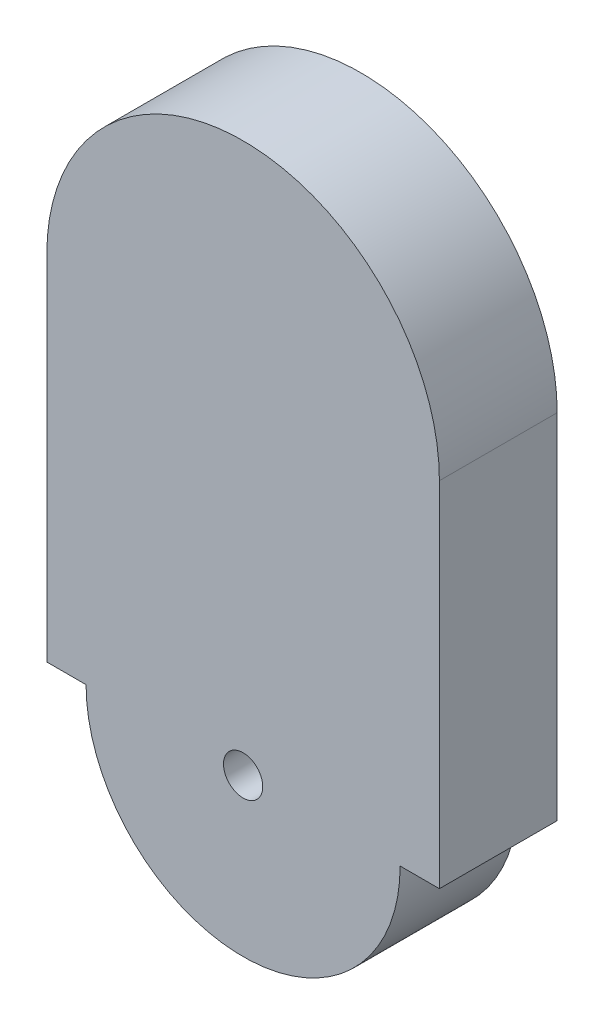
ISO-10303-21;
HEADER;
FILE_DESCRIPTION(('STEP AP214'),'2;1');
FILE_NAME('part.step','',(''),(''),'','','');
FILE_SCHEMA(('AUTOMOTIVE_DESIGN { 1 0 10303 214 1 1 1 1 }'));
ENDSEC;
DATA;
#1=APPLICATION_CONTEXT('core data for automotive mechanical design processes');
#2=APPLICATION_PROTOCOL_DEFINITION('international standard','automotive_design',2000,#1);
#3=PRODUCT_CONTEXT('',#1,'mechanical');
#4=PRODUCT('Part','Part','',(#3));
#5=PRODUCT_RELATED_PRODUCT_CATEGORY('part','',(#4));
#6=PRODUCT_DEFINITION_FORMATION('','',#4);
#7=PRODUCT_DEFINITION_CONTEXT('part definition',#1,'design');
#8=PRODUCT_DEFINITION('design','',#6,#7);
#9=PRODUCT_DEFINITION_SHAPE('','',#8);
#10=(LENGTH_UNIT() NAMED_UNIT(*) SI_UNIT(.MILLI.,.METRE.));
#11=(NAMED_UNIT(*) PLANE_ANGLE_UNIT() SI_UNIT($,.RADIAN.));
#12=(NAMED_UNIT(*) SI_UNIT($,.STERADIAN.) SOLID_ANGLE_UNIT());
#13=UNCERTAINTY_MEASURE_WITH_UNIT(LENGTH_MEASURE(1.E-05),#10,'distance_accuracy_value','');
#14=(GEOMETRIC_REPRESENTATION_CONTEXT(3) GLOBAL_UNCERTAINTY_ASSIGNED_CONTEXT((#13)) GLOBAL_UNIT_ASSIGNED_CONTEXT((#10,
#11,#12)) REPRESENTATION_CONTEXT('',''));
#15=CARTESIAN_POINT('',(0.,0.,0.));
#16=DIRECTION('',(0.,0.,1.));
#17=DIRECTION('',(1.,0.,0.));
#18=AXIS2_PLACEMENT_3D('',#15,#16,#17);
#19=CARTESIAN_POINT('',(0.,28.575,0.));
#20=DIRECTION('',(0.,0.,1.));
#21=DIRECTION('',(1.,0.,0.));
#22=AXIS2_PLACEMENT_3D('',#19,#20,#21);
#23=PLANE('',#22);
#24=CARTESIAN_POINT('',(0.,28.575,0.));
#25=DIRECTION('',(0.,0.,1.));
#26=DIRECTION('',(1.,0.,0.));
#27=AXIS2_PLACEMENT_3D('',#24,#25,#26);
#28=CIRCLE('',#27,31.75);
#29=CARTESIAN_POINT('',(31.75,28.575,0.));
#30=VERTEX_POINT('',#29);
#31=CARTESIAN_POINT('',(-31.75,28.5749999999984,0.));
#32=VERTEX_POINT('',#31);
#33=EDGE_CURVE('E128',#30,#32,#28,.T.);
#34=ORIENTED_EDGE('',*,*,#33,.F.);
#35=DIRECTION('',(0.,1.,0.));
#36=VECTOR('',#35,1.);
#37=CARTESIAN_POINT('',(31.75,28.575,0.));
#38=LINE('',#37,#36);
#39=CARTESIAN_POINT('',(31.75,-28.575,0.));
#40=VERTEX_POINT('',#39);
#41=EDGE_CURVE('E85',#40,#30,#38,.T.);
#42=ORIENTED_EDGE('',*,*,#41,.F.);
#43=DIRECTION('',(1.,0.,0.));
#44=VECTOR('',#43,1.);
#45=CARTESIAN_POINT('',(25.4,-28.575,0.));
#46=LINE('',#45,#44);
#47=CARTESIAN_POINT('',(25.4,-28.575,0.));
#48=VERTEX_POINT('',#47);
#49=EDGE_CURVE('E79',#48,#40,#46,.T.);
#50=ORIENTED_EDGE('',*,*,#49,.F.);
#51=CARTESIAN_POINT('',(0.,-28.575,0.));
#52=DIRECTION('',(0.,0.,1.));
#53=DIRECTION('',(1.,0.,0.));
#54=AXIS2_PLACEMENT_3D('',#51,#52,#53);
#55=CIRCLE('',#54,25.4);
#56=CARTESIAN_POINT('',(-25.4,-28.575,0.));
#57=VERTEX_POINT('',#56);
#58=EDGE_CURVE('E115',#57,#48,#55,.T.);
#59=ORIENTED_EDGE('',*,*,#58,.F.);
#60=DIRECTION('',(1.,0.,0.));
#61=VECTOR('',#60,1.);
#62=CARTESIAN_POINT('',(-31.75,-28.575,0.));
#63=LINE('',#62,#61);
#64=CARTESIAN_POINT('',(-31.75,-28.575,0.));
#65=VERTEX_POINT('',#64);
#66=EDGE_CURVE('E136',#65,#57,#63,.T.);
#67=ORIENTED_EDGE('',*,*,#66,.F.);
#68=DIRECTION('',(0.,-1.,0.));
#69=VECTOR('',#68,1.);
#70=CARTESIAN_POINT('',(-31.75,28.5749999999984,0.));
#71=LINE('',#70,#69);
#72=EDGE_CURVE('E132',#32,#65,#71,.T.);
#73=ORIENTED_EDGE('',*,*,#72,.F.);
#74=EDGE_LOOP('',(#34,#42,#50,#59,#67,#73));
#75=FACE_BOUND('',#74,.T.);
#76=CARTESIAN_POINT('',(0.,-28.575,0.));
#77=DIRECTION('',(0.,0.,-1.));
#78=DIRECTION('',(-1.,0.,0.));
#79=AXIS2_PLACEMENT_3D('',#76,#77,#78);
#80=CIRCLE('',#79,3.17499999999999);
#81=CARTESIAN_POINT('',(-3.175,-28.575,0.));
#82=VERTEX_POINT('',#81);
#83=EDGE_CURVE('E191',#82,#82,#80,.T.);
#84=ORIENTED_EDGE('',*,*,#83,.F.);
#85=EDGE_LOOP('',(#84));
#86=FACE_BOUND('',#85,.T.);
#87=ADVANCED_FACE('F38',(#75,#86),#23,.F.);
#88=CARTESIAN_POINT('',(0.,28.575,19.05));
#89=DIRECTION('',(0.,0.,-1.));
#90=DIRECTION('',(-1.,0.,0.));
#91=AXIS2_PLACEMENT_3D('',#88,#89,#90);
#92=CYLINDRICAL_SURFACE('',#91,31.75);
#93=ORIENTED_EDGE('',*,*,#33,.T.);
#94=DIRECTION('',(0.,0.,-1.));
#95=VECTOR('',#94,1.);
#96=CARTESIAN_POINT('',(-31.75,28.5749999999984,19.05));
#97=LINE('',#96,#95);
#98=CARTESIAN_POINT('',(-31.75,28.5749999999984,19.05));
#99=VERTEX_POINT('',#98);
#100=EDGE_CURVE('E11',#99,#32,#97,.T.);
#101=ORIENTED_EDGE('',*,*,#100,.F.);
#102=CARTESIAN_POINT('',(0.,28.575,19.05));
#103=DIRECTION('',(0.,0.,1.));
#104=DIRECTION('',(1.,0.,0.));
#105=AXIS2_PLACEMENT_3D('',#102,#103,#104);
#106=CIRCLE('',#105,31.75);
#107=CARTESIAN_POINT('',(31.75,28.575,19.05));
#108=VERTEX_POINT('',#107);
#109=EDGE_CURVE('E145',#108,#99,#106,.T.);
#110=ORIENTED_EDGE('',*,*,#109,.F.);
#111=DIRECTION('',(0.,0.,-1.));
#112=VECTOR('',#111,1.);
#113=CARTESIAN_POINT('',(31.75,28.575,19.05));
#114=LINE('',#113,#112);
#115=EDGE_CURVE('E124',#108,#30,#114,.T.);
#116=ORIENTED_EDGE('',*,*,#115,.T.);
#117=EDGE_LOOP('',(#93,#101,#110,#116));
#118=FACE_BOUND('',#117,.T.);
#119=ADVANCED_FACE('F40',(#118),#92,.T.);
#120=CARTESIAN_POINT('',(-31.75,28.5749999999984,19.05));
#121=DIRECTION('',(1.,0.,0.));
#122=DIRECTION('',(0.,1.,0.));
#123=AXIS2_PLACEMENT_3D('',#120,#121,#122);
#124=PLANE('',#123);
#125=ORIENTED_EDGE('',*,*,#72,.T.);
#126=DIRECTION('',(0.,0.,-1.));
#127=VECTOR('',#126,1.);
#128=CARTESIAN_POINT('',(-31.75,-28.575,19.05));
#129=LINE('',#128,#127);
#130=CARTESIAN_POINT('',(-31.75,-28.575,19.05));
#131=VERTEX_POINT('',#130);
#132=EDGE_CURVE('E48',#131,#65,#129,.T.);
#133=ORIENTED_EDGE('',*,*,#132,.F.);
#134=DIRECTION('',(0.,-1.,0.));
#135=VECTOR('',#134,1.);
#136=CARTESIAN_POINT('',(-31.75,28.5749999999984,19.05));
#137=LINE('',#136,#135);
#138=EDGE_CURVE('E93',#99,#131,#137,.T.);
#139=ORIENTED_EDGE('',*,*,#138,.F.);
#140=ORIENTED_EDGE('',*,*,#100,.T.);
#141=EDGE_LOOP('',(#125,#133,#139,#140));
#142=FACE_BOUND('',#141,.T.);
#143=ADVANCED_FACE('F179',(#142),#124,.F.);
#144=CARTESIAN_POINT('',(-31.75,-28.575,19.05));
#145=DIRECTION('',(0.,1.,0.));
#146=DIRECTION('',(0.,0.,1.));
#147=AXIS2_PLACEMENT_3D('',#144,#145,#146);
#148=PLANE('',#147);
#149=ORIENTED_EDGE('',*,*,#66,.T.);
#150=DIRECTION('',(0.,0.,-1.));
#151=VECTOR('',#150,1.);
#152=CARTESIAN_POINT('',(-25.4,-28.575,19.05));
#153=LINE('',#152,#151);
#154=CARTESIAN_POINT('',(-25.4,-28.575,19.05));
#155=VERTEX_POINT('',#154);
#156=EDGE_CURVE('E117',#155,#57,#153,.T.);
#157=ORIENTED_EDGE('',*,*,#156,.F.);
#158=DIRECTION('',(1.,0.,0.));
#159=VECTOR('',#158,1.);
#160=CARTESIAN_POINT('',(-31.75,-28.575,19.05));
#161=LINE('',#160,#159);
#162=EDGE_CURVE('E106',#131,#155,#161,.T.);
#163=ORIENTED_EDGE('',*,*,#162,.F.);
#164=ORIENTED_EDGE('',*,*,#132,.T.);
#165=EDGE_LOOP('',(#149,#157,#163,#164));
#166=FACE_BOUND('',#165,.T.);
#167=ADVANCED_FACE('F155',(#166),#148,.F.);
#168=CARTESIAN_POINT('',(0.,-28.575,19.05));
#169=DIRECTION('',(0.,0.,-1.));
#170=DIRECTION('',(-1.,0.,0.));
#171=AXIS2_PLACEMENT_3D('',#168,#169,#170);
#172=CYLINDRICAL_SURFACE('',#171,25.4);
#173=ORIENTED_EDGE('',*,*,#58,.T.);
#174=DIRECTION('',(0.,0.,-1.));
#175=VECTOR('',#174,1.);
#176=CARTESIAN_POINT('',(25.4,-28.575,19.05));
#177=LINE('',#176,#175);
#178=CARTESIAN_POINT('',(25.4,-28.575,19.05));
#179=VERTEX_POINT('',#178);
#180=EDGE_CURVE('E112',#179,#48,#177,.T.);
#181=ORIENTED_EDGE('',*,*,#180,.F.);
#182=CARTESIAN_POINT('',(0.,-28.575,19.05));
#183=DIRECTION('',(0.,0.,1.));
#184=DIRECTION('',(1.,0.,0.));
#185=AXIS2_PLACEMENT_3D('',#182,#183,#184);
#186=CIRCLE('',#185,25.4);
#187=EDGE_CURVE('E100',#155,#179,#186,.T.);
#188=ORIENTED_EDGE('',*,*,#187,.F.);
#189=ORIENTED_EDGE('',*,*,#156,.T.);
#190=EDGE_LOOP('',(#173,#181,#188,#189));
#191=FACE_BOUND('',#190,.T.);
#192=ADVANCED_FACE('F113',(#191),#172,.T.);
#193=CARTESIAN_POINT('',(25.4,-28.575,19.05));
#194=DIRECTION('',(0.,1.,0.));
#195=DIRECTION('',(0.,0.,1.));
#196=AXIS2_PLACEMENT_3D('',#193,#194,#195);
#197=PLANE('',#196);
#198=ORIENTED_EDGE('',*,*,#49,.T.);
#199=DIRECTION('',(0.,0.,-1.));
#200=VECTOR('',#199,1.);
#201=CARTESIAN_POINT('',(31.75,-28.575,19.05));
#202=LINE('',#201,#200);
#203=CARTESIAN_POINT('',(31.75,-28.575,19.05));
#204=VERTEX_POINT('',#203);
#205=EDGE_CURVE('E118',#204,#40,#202,.T.);
#206=ORIENTED_EDGE('',*,*,#205,.F.);
#207=DIRECTION('',(1.,0.,0.));
#208=VECTOR('',#207,1.);
#209=CARTESIAN_POINT('',(25.4,-28.575,19.05));
#210=LINE('',#209,#208);
#211=EDGE_CURVE('E104',#179,#204,#210,.T.);
#212=ORIENTED_EDGE('',*,*,#211,.F.);
#213=ORIENTED_EDGE('',*,*,#180,.T.);
#214=EDGE_LOOP('',(#198,#206,#212,#213));
#215=FACE_BOUND('',#214,.T.);
#216=ADVANCED_FACE('F120',(#215),#197,.F.);
#217=CARTESIAN_POINT('',(31.75,28.575,19.05));
#218=DIRECTION('',(-1.,0.,0.));
#219=DIRECTION('',(0.,0.,1.));
#220=AXIS2_PLACEMENT_3D('',#217,#218,#219);
#221=PLANE('',#220);
#222=ORIENTED_EDGE('',*,*,#41,.T.);
#223=ORIENTED_EDGE('',*,*,#115,.F.);
#224=DIRECTION('',(0.,1.,0.));
#225=VECTOR('',#224,1.);
#226=CARTESIAN_POINT('',(31.75,28.575,19.05));
#227=LINE('',#226,#225);
#228=EDGE_CURVE('E56',#204,#108,#227,.T.);
#229=ORIENTED_EDGE('',*,*,#228,.F.);
#230=ORIENTED_EDGE('',*,*,#205,.T.);
#231=EDGE_LOOP('',(#222,#223,#229,#230));
#232=FACE_BOUND('',#231,.T.);
#233=ADVANCED_FACE('F162',(#232),#221,.F.);
#234=CARTESIAN_POINT('',(0.,28.575,19.05));
#235=DIRECTION('',(0.,0.,1.));
#236=DIRECTION('',(1.,0.,0.));
#237=AXIS2_PLACEMENT_3D('',#234,#235,#236);
#238=PLANE('',#237);
#239=CARTESIAN_POINT('',(0.,-28.575,19.05));
#240=DIRECTION('',(0.,0.,-1.));
#241=DIRECTION('',(-1.,0.,0.));
#242=AXIS2_PLACEMENT_3D('',#239,#240,#241);
#243=CIRCLE('',#242,3.17499999999999);
#244=CARTESIAN_POINT('',(-3.175,-28.575,19.05));
#245=VERTEX_POINT('',#244);
#246=EDGE_CURVE('E133',#245,#245,#243,.T.);
#247=ORIENTED_EDGE('',*,*,#246,.T.);
#248=EDGE_LOOP('',(#247));
#249=FACE_BOUND('',#248,.T.);
#250=ORIENTED_EDGE('',*,*,#109,.T.);
#251=ORIENTED_EDGE('',*,*,#138,.T.);
#252=ORIENTED_EDGE('',*,*,#162,.T.);
#253=ORIENTED_EDGE('',*,*,#187,.T.);
#254=ORIENTED_EDGE('',*,*,#211,.T.);
#255=ORIENTED_EDGE('',*,*,#228,.T.);
#256=EDGE_LOOP('',(#250,#251,#252,#253,#254,#255));
#257=FACE_BOUND('',#256,.T.);
#258=ADVANCED_FACE('F102',(#249,#257),#238,.T.);
#259=CARTESIAN_POINT('',(0.,-28.575,0.));
#260=DIRECTION('',(0.,0.,-1.));
#261=DIRECTION('',(-1.,0.,0.));
#262=AXIS2_PLACEMENT_3D('',#259,#260,#261);
#263=CYLINDRICAL_SURFACE('',#262,3.17499999999999);
#264=ORIENTED_EDGE('',*,*,#246,.F.);
#265=EDGE_LOOP('',(#264));
#266=FACE_BOUND('',#265,.T.);
#267=ORIENTED_EDGE('',*,*,#83,.T.);
#268=EDGE_LOOP('',(#267));
#269=FACE_BOUND('',#268,.T.);
#270=ADVANCED_FACE('F170',(#266,#269),#263,.F.);
#271=CLOSED_SHELL('',(#87,#119,#143,#167,#192,#216,#233,#258,#270));
#272=MANIFOLD_SOLID_BREP('B2',#271);
#273=ADVANCED_BREP_SHAPE_REPRESENTATION('',(#18,#272),#14);
#274=SHAPE_DEFINITION_REPRESENTATION(#9,#273);
ENDSEC;
END-ISO-10303-21;
